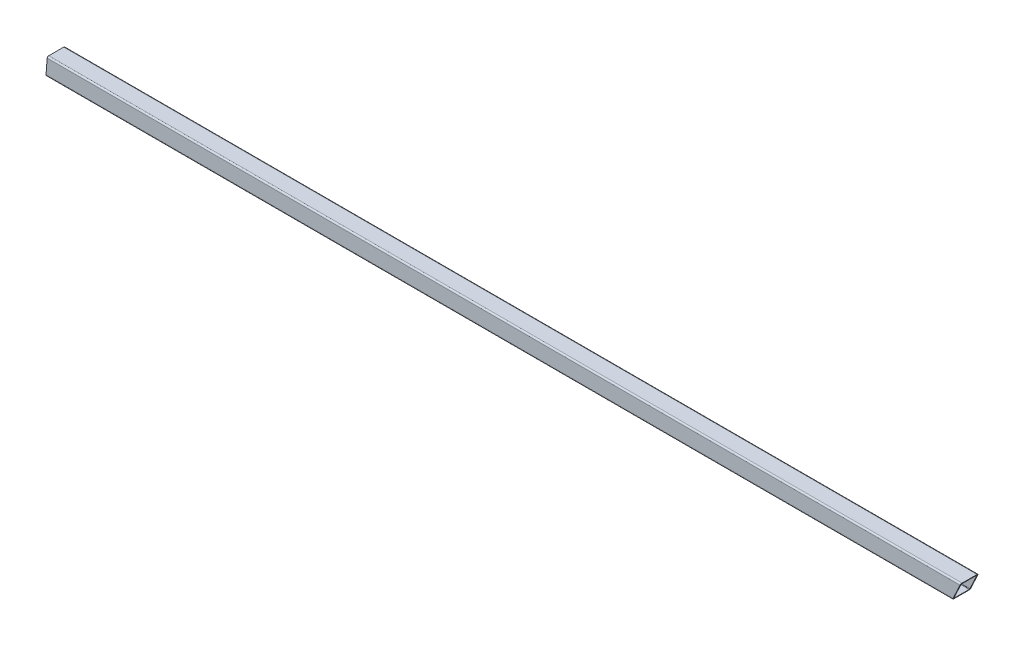
ISO-10303-21;
HEADER;
FILE_DESCRIPTION(('STEP AP214'),'2;1');
FILE_NAME('part.step','',(''),(''),'','','');
FILE_SCHEMA(('AUTOMOTIVE_DESIGN { 1 0 10303 214 1 1 1 1 }'));
ENDSEC;
DATA;
#1=APPLICATION_CONTEXT('core data for automotive mechanical design processes');
#2=APPLICATION_PROTOCOL_DEFINITION('international standard','automotive_design',2000,#1);
#3=PRODUCT_CONTEXT('',#1,'mechanical');
#4=PRODUCT('Part','Part','',(#3));
#5=PRODUCT_RELATED_PRODUCT_CATEGORY('part','',(#4));
#6=PRODUCT_DEFINITION_FORMATION('','',#4);
#7=PRODUCT_DEFINITION_CONTEXT('part definition',#1,'design');
#8=PRODUCT_DEFINITION('design','',#6,#7);
#9=PRODUCT_DEFINITION_SHAPE('','',#8);
#10=(LENGTH_UNIT() NAMED_UNIT(*) SI_UNIT(.MILLI.,.METRE.));
#11=(NAMED_UNIT(*) PLANE_ANGLE_UNIT() SI_UNIT($,.RADIAN.));
#12=(NAMED_UNIT(*) SI_UNIT($,.STERADIAN.) SOLID_ANGLE_UNIT());
#13=UNCERTAINTY_MEASURE_WITH_UNIT(LENGTH_MEASURE(1.E-05),#10,'distance_accuracy_value','');
#14=(GEOMETRIC_REPRESENTATION_CONTEXT(3) GLOBAL_UNCERTAINTY_ASSIGNED_CONTEXT((#13)) GLOBAL_UNIT_ASSIGNED_CONTEXT((#10,
#11,#12)) REPRESENTATION_CONTEXT('',''));
#15=CARTESIAN_POINT('',(0.,0.,0.));
#16=DIRECTION('',(0.,0.,1.));
#17=DIRECTION('',(1.,0.,0.));
#18=AXIS2_PLACEMENT_3D('',#15,#16,#17);
#19=CARTESIAN_POINT('',(1320.8,10.1854,21.209));
#20=DIRECTION('',(0.,1.,0.));
#21=DIRECTION('',(0.,0.,1.));
#22=AXIS2_PLACEMENT_3D('',#19,#20,#21);
#23=PLANE('',#22);
#24=DIRECTION('',(0.,0.,1.));
#25=VECTOR('',#24,1.);
#26=CARTESIAN_POINT('',(1315.18584231888,10.1854,21.209));
#27=LINE('',#26,#25);
#28=CARTESIAN_POINT('',(1315.18584231888,10.1854,10.541));
#29=VERTEX_POINT('',#28);
#30=CARTESIAN_POINT('',(1315.18584231888,10.1854,21.209));
#31=VERTEX_POINT('',#30);
#32=EDGE_CURVE('E11',#29,#31,#27,.T.);
#33=ORIENTED_EDGE('',*,*,#32,.F.);
#34=DIRECTION('',(-1.,0.,0.));
#35=VECTOR('',#34,1.);
#36=CARTESIAN_POINT('',(1320.8,10.1854,10.541));
#37=LINE('',#36,#35);
#38=CARTESIAN_POINT('',(669.151527464938,10.1854,10.541));
#39=VERTEX_POINT('',#38);
#40=EDGE_CURVE('E197',#29,#39,#37,.T.);
#41=ORIENTED_EDGE('',*,*,#40,.T.);
#42=DIRECTION('',(0.,0.,-1.));
#43=VECTOR('',#42,1.);
#44=CARTESIAN_POINT('',(669.151527464938,10.1854,21.209));
#45=LINE('',#44,#43);
#46=CARTESIAN_POINT('',(669.151527464938,10.1854,21.209));
#47=VERTEX_POINT('',#46);
#48=EDGE_CURVE('E53',#47,#39,#45,.T.);
#49=ORIENTED_EDGE('',*,*,#48,.F.);
#50=DIRECTION('',(-1.,0.,0.));
#51=VECTOR('',#50,1.);
#52=CARTESIAN_POINT('',(1320.8,10.1854,21.209));
#53=LINE('',#52,#51);
#54=EDGE_CURVE('E200',#31,#47,#53,.T.);
#55=ORIENTED_EDGE('',*,*,#54,.F.);
#56=EDGE_LOOP('',(#33,#41,#49,#55));
#57=FACE_BOUND('',#56,.T.);
#58=ADVANCED_FACE('F46',(#57),#23,.T.);
#59=CARTESIAN_POINT('',(1320.8,10.541,21.209));
#60=DIRECTION('',(-1.,0.,0.));
#61=DIRECTION('',(0.,0.,1.));
#62=AXIS2_PLACEMENT_3D('',#59,#60,#61);
#63=CYLINDRICAL_SURFACE('',#62,0.355600000000001);
#64=CARTESIAN_POINT('',(1315.35166132212,10.541,21.209));
#65=DIRECTION('',(-0.906307787036651,0.422618261740698,0.));
#66=DIRECTION('',(-0.422618261740698,-0.906307787036651,0.));
#67=AXIS2_PLACEMENT_3D('',#64,#65,#66);
#68=ELLIPSE('',#67,0.392361187983063,0.355600000000001);
#69=CARTESIAN_POINT('',(1315.35166132212,10.541,21.5646));
#70=VERTEX_POINT('',#69);
#71=EDGE_CURVE('E276',#31,#70,#68,.T.);
#72=ORIENTED_EDGE('',*,*,#71,.F.);
#73=ORIENTED_EDGE('',*,*,#54,.T.);
#74=CARTESIAN_POINT('',(669.179554768912,10.541,21.209));
#75=DIRECTION('',(0.996908341817186,-0.0785732652707514,0.));
#76=DIRECTION('',(-0.0785732652707514,-0.996908341817186,0.));
#77=AXIS2_PLACEMENT_3D('',#74,#75,#76);
#78=ELLIPSE('',#77,0.356702803140162,0.355600000000001);
#79=CARTESIAN_POINT('',(669.179554768912,10.541,21.5646));
#80=VERTEX_POINT('',#79);
#81=EDGE_CURVE('E259',#80,#47,#78,.T.);
#82=ORIENTED_EDGE('',*,*,#81,.F.);
#83=DIRECTION('',(-1.,0.,0.));
#84=VECTOR('',#83,1.);
#85=CARTESIAN_POINT('',(1320.8,10.541,21.5646));
#86=LINE('',#85,#84);
#87=EDGE_CURVE('E218',#70,#80,#86,.T.);
#88=ORIENTED_EDGE('',*,*,#87,.F.);
#89=EDGE_LOOP('',(#72,#73,#82,#88));
#90=FACE_BOUND('',#89,.T.);
#91=ADVANCED_FACE('F310',(#90),#63,.F.);
#92=CARTESIAN_POINT('',(1320.8,21.209,21.5646));
#93=DIRECTION('',(0.,0.,-1.));
#94=DIRECTION('',(-1.,0.,0.));
#95=AXIS2_PLACEMENT_3D('',#92,#93,#94);
#96=PLANE('',#95);
#97=DIRECTION('',(0.422618261740698,0.906307787036651,0.));
#98=VECTOR('',#97,1.);
#99=CARTESIAN_POINT('',(1320.4108494229,21.3904638942792,21.5646));
#100=LINE('',#99,#98);
#101=CARTESIAN_POINT('',(1320.32623141931,21.209,21.5646));
#102=VERTEX_POINT('',#101);
#103=EDGE_CURVE('E278',#70,#102,#100,.T.);
#104=ORIENTED_EDGE('',*,*,#103,.F.);
#105=ORIENTED_EDGE('',*,*,#87,.T.);
#106=DIRECTION('',(-0.0785732652707514,-0.996908341817186,0.));
#107=VECTOR('',#106,1.);
#108=CARTESIAN_POINT('',(674.038129821038,72.1847917161635,21.5646));
#109=LINE('',#108,#107);
#110=CARTESIAN_POINT('',(670.020373888131,21.209,21.5646));
#111=VERTEX_POINT('',#110);
#112=EDGE_CURVE('E261',#111,#80,#109,.T.);
#113=ORIENTED_EDGE('',*,*,#112,.F.);
#114=DIRECTION('',(-1.,0.,0.));
#115=VECTOR('',#114,1.);
#116=CARTESIAN_POINT('',(1320.8,21.209,21.5646));
#117=LINE('',#116,#115);
#118=EDGE_CURVE('E215',#102,#111,#117,.T.);
#119=ORIENTED_EDGE('',*,*,#118,.F.);
#120=EDGE_LOOP('',(#104,#105,#113,#119));
#121=FACE_BOUND('',#120,.T.);
#122=ADVANCED_FACE('F315',(#121),#96,.T.);
#123=CARTESIAN_POINT('',(1320.8,21.209,21.209));
#124=DIRECTION('',(-1.,0.,0.));
#125=DIRECTION('',(0.,0.,1.));
#126=AXIS2_PLACEMENT_3D('',#123,#124,#125);
#127=CYLINDRICAL_SURFACE('',#126,0.355600000000003);
#128=CARTESIAN_POINT('',(1320.32623141931,21.209,21.209));
#129=DIRECTION('',(-0.906307787036651,0.422618261740698,0.));
#130=DIRECTION('',(-0.422618261740698,-0.906307787036651,0.));
#131=AXIS2_PLACEMENT_3D('',#128,#129,#130);
#132=ELLIPSE('',#131,0.392361187983065,0.355600000000003);
#133=CARTESIAN_POINT('',(1320.49205042255,21.5646,21.209));
#134=VERTEX_POINT('',#133);
#135=EDGE_CURVE('E280',#102,#134,#132,.T.);
#136=ORIENTED_EDGE('',*,*,#135,.F.);
#137=ORIENTED_EDGE('',*,*,#118,.T.);
#138=CARTESIAN_POINT('',(670.020373888131,21.209,21.209));
#139=DIRECTION('',(0.996908341817186,-0.0785732652707514,0.));
#140=DIRECTION('',(-0.0785732652707514,-0.996908341817186,0.));
#141=AXIS2_PLACEMENT_3D('',#138,#139,#140);
#142=ELLIPSE('',#141,0.356702803140164,0.355600000000003);
#143=CARTESIAN_POINT('',(670.048401192105,21.5646,21.209));
#144=VERTEX_POINT('',#143);
#145=EDGE_CURVE('E263',#144,#111,#142,.T.);
#146=ORIENTED_EDGE('',*,*,#145,.F.);
#147=DIRECTION('',(-1.,0.,0.));
#148=VECTOR('',#147,1.);
#149=CARTESIAN_POINT('',(1320.8,21.5646,21.209));
#150=LINE('',#149,#148);
#151=EDGE_CURVE('E212',#134,#144,#150,.T.);
#152=ORIENTED_EDGE('',*,*,#151,.F.);
#153=EDGE_LOOP('',(#136,#137,#146,#152));
#154=FACE_BOUND('',#153,.T.);
#155=ADVANCED_FACE('F344',(#154),#127,.F.);
#156=CARTESIAN_POINT('',(1320.8,21.5646,10.541));
#157=DIRECTION('',(0.,-1.,0.));
#158=DIRECTION('',(0.,0.,-1.));
#159=AXIS2_PLACEMENT_3D('',#156,#157,#158);
#160=PLANE('',#159);
#161=DIRECTION('',(0.,0.,-1.));
#162=VECTOR('',#161,1.);
#163=CARTESIAN_POINT('',(1320.49205042255,21.5646,10.541));
#164=LINE('',#163,#162);
#165=CARTESIAN_POINT('',(1320.49205042255,21.5646,10.541));
#166=VERTEX_POINT('',#165);
#167=EDGE_CURVE('E282',#134,#166,#164,.T.);
#168=ORIENTED_EDGE('',*,*,#167,.F.);
#169=ORIENTED_EDGE('',*,*,#151,.T.);
#170=DIRECTION('',(0.,0.,1.));
#171=VECTOR('',#170,1.);
#172=CARTESIAN_POINT('',(670.048401192105,21.5646,10.541));
#173=LINE('',#172,#171);
#174=CARTESIAN_POINT('',(670.048401192105,21.5646,10.541));
#175=VERTEX_POINT('',#174);
#176=EDGE_CURVE('E265',#175,#144,#173,.T.);
#177=ORIENTED_EDGE('',*,*,#176,.F.);
#178=DIRECTION('',(-1.,0.,0.));
#179=VECTOR('',#178,1.);
#180=CARTESIAN_POINT('',(1320.8,21.5646,10.541));
#181=LINE('',#180,#179);
#182=EDGE_CURVE('E209',#166,#175,#181,.T.);
#183=ORIENTED_EDGE('',*,*,#182,.F.);
#184=EDGE_LOOP('',(#168,#169,#177,#183));
#185=FACE_BOUND('',#184,.T.);
#186=ADVANCED_FACE('F340',(#185),#160,.T.);
#187=CARTESIAN_POINT('',(1320.8,21.209,10.541));
#188=DIRECTION('',(-1.,0.,0.));
#189=DIRECTION('',(0.,0.,1.));
#190=AXIS2_PLACEMENT_3D('',#187,#188,#189);
#191=CYLINDRICAL_SURFACE('',#190,0.3556);
#192=CARTESIAN_POINT('',(1320.32623141931,21.209,10.541));
#193=DIRECTION('',(-0.906307787036651,0.422618261740698,0.));
#194=DIRECTION('',(-0.422618261740698,-0.906307787036651,0.));
#195=AXIS2_PLACEMENT_3D('',#192,#193,#194);
#196=ELLIPSE('',#195,0.392361187983062,0.3556);
#197=CARTESIAN_POINT('',(1320.32623141931,21.209,10.1854));
#198=VERTEX_POINT('',#197);
#199=EDGE_CURVE('E284',#166,#198,#196,.T.);
#200=ORIENTED_EDGE('',*,*,#199,.F.);
#201=ORIENTED_EDGE('',*,*,#182,.T.);
#202=CARTESIAN_POINT('',(670.020373888131,21.209,10.541));
#203=DIRECTION('',(0.996908341817186,-0.0785732652707514,0.));
#204=DIRECTION('',(-0.0785732652707514,-0.996908341817186,0.));
#205=AXIS2_PLACEMENT_3D('',#202,#203,#204);
#206=ELLIPSE('',#205,0.356702803140161,0.3556);
#207=CARTESIAN_POINT('',(670.020373888131,21.209,10.1854));
#208=VERTEX_POINT('',#207);
#209=EDGE_CURVE('E267',#208,#175,#206,.T.);
#210=ORIENTED_EDGE('',*,*,#209,.F.);
#211=DIRECTION('',(-1.,0.,0.));
#212=VECTOR('',#211,1.);
#213=CARTESIAN_POINT('',(1320.8,21.209,10.1854));
#214=LINE('',#213,#212);
#215=EDGE_CURVE('E206',#198,#208,#214,.T.);
#216=ORIENTED_EDGE('',*,*,#215,.F.);
#217=EDGE_LOOP('',(#200,#201,#210,#216));
#218=FACE_BOUND('',#217,.T.);
#219=ADVANCED_FACE('F334',(#218),#191,.F.);
#220=CARTESIAN_POINT('',(1320.8,10.541,10.1854));
#221=DIRECTION('',(0.,0.,1.));
#222=DIRECTION('',(1.,0.,0.));
#223=AXIS2_PLACEMENT_3D('',#220,#221,#222);
#224=PLANE('',#223);
#225=DIRECTION('',(-0.422618261740698,-0.906307787036651,0.));
#226=VECTOR('',#225,1.);
#227=CARTESIAN_POINT('',(1316.3247683633,12.6278347842112,10.1854));
#228=LINE('',#227,#226);
#229=CARTESIAN_POINT('',(1315.35166132212,10.541,10.1854));
#230=VERTEX_POINT('',#229);
#231=EDGE_CURVE('E286',#198,#230,#228,.T.);
#232=ORIENTED_EDGE('',*,*,#231,.F.);
#233=ORIENTED_EDGE('',*,*,#215,.T.);
#234=DIRECTION('',(0.0785732652707514,0.996908341817186,0.));
#235=VECTOR('',#234,1.);
#236=CARTESIAN_POINT('',(673.202501715596,61.5826533666708,10.1854));
#237=LINE('',#236,#235);
#238=CARTESIAN_POINT('',(669.179554768912,10.541,10.1854));
#239=VERTEX_POINT('',#238);
#240=EDGE_CURVE('E269',#239,#208,#237,.T.);
#241=ORIENTED_EDGE('',*,*,#240,.F.);
#242=DIRECTION('',(-1.,0.,0.));
#243=VECTOR('',#242,1.);
#244=CARTESIAN_POINT('',(1320.8,10.541,10.1854));
#245=LINE('',#244,#243);
#246=EDGE_CURVE('E202',#230,#239,#245,.T.);
#247=ORIENTED_EDGE('',*,*,#246,.F.);
#248=EDGE_LOOP('',(#232,#233,#241,#247));
#249=FACE_BOUND('',#248,.T.);
#250=ADVANCED_FACE('F330',(#249),#224,.T.);
#251=CARTESIAN_POINT('',(1320.8,10.541,10.541));
#252=DIRECTION('',(-1.,0.,0.));
#253=DIRECTION('',(0.,0.,1.));
#254=AXIS2_PLACEMENT_3D('',#251,#252,#253);
#255=CYLINDRICAL_SURFACE('',#254,0.3556);
#256=CARTESIAN_POINT('',(1315.35166132212,10.541,10.541));
#257=DIRECTION('',(-0.906307787036651,0.422618261740698,0.));
#258=DIRECTION('',(-0.422618261740698,-0.906307787036651,0.));
#259=AXIS2_PLACEMENT_3D('',#256,#257,#258);
#260=ELLIPSE('',#259,0.392361187983062,0.3556);
#261=EDGE_CURVE('E248',#230,#29,#260,.T.);
#262=ORIENTED_EDGE('',*,*,#261,.F.);
#263=ORIENTED_EDGE('',*,*,#246,.T.);
#264=CARTESIAN_POINT('',(669.179554768912,10.541,10.541));
#265=DIRECTION('',(0.996908341817186,-0.0785732652707514,0.));
#266=DIRECTION('',(-0.0785732652707514,-0.996908341817186,0.));
#267=AXIS2_PLACEMENT_3D('',#264,#265,#266);
#268=ELLIPSE('',#267,0.356702803140161,0.3556);
#269=EDGE_CURVE('E271',#39,#239,#268,.T.);
#270=ORIENTED_EDGE('',*,*,#269,.F.);
#271=ORIENTED_EDGE('',*,*,#40,.F.);
#272=EDGE_LOOP('',(#262,#263,#270,#271));
#273=FACE_BOUND('',#272,.T.);
#274=ADVANCED_FACE('F324',(#273),#255,.F.);
#275=CARTESIAN_POINT('',(670.100451899485,22.225,22.225));
#276=DIRECTION('',(0.996908341817186,-0.0785732652707514,0.));
#277=DIRECTION('',(0.0785732652707514,0.996908341817186,0.));
#278=AXIS2_PLACEMENT_3D('',#275,#276,#277);
#279=PLANE('',#278);
#280=ORIENTED_EDGE('',*,*,#269,.T.);
#281=ORIENTED_EDGE('',*,*,#240,.T.);
#282=ORIENTED_EDGE('',*,*,#209,.T.);
#283=ORIENTED_EDGE('',*,*,#176,.T.);
#284=ORIENTED_EDGE('',*,*,#145,.T.);
#285=ORIENTED_EDGE('',*,*,#112,.T.);
#286=ORIENTED_EDGE('',*,*,#81,.T.);
#287=ORIENTED_EDGE('',*,*,#48,.T.);
#288=EDGE_LOOP('',(#280,#281,#282,#283,#284,#285,#286,#287));
#289=FACE_BOUND('',#288,.T.);
#290=DIRECTION('',(-0.0785732652707514,-0.996908341817186,0.));
#291=VECTOR('',#290,1.);
#292=CARTESIAN_POINT('',(670.100451899485,22.225,22.225));
#293=LINE('',#292,#291);
#294=CARTESIAN_POINT('',(670.020373888131,21.209,22.225));
#295=VERTEX_POINT('',#294);
#296=CARTESIAN_POINT('',(669.179554768912,10.541,22.225));
#297=VERTEX_POINT('',#296);
#298=EDGE_CURVE('E178',#295,#297,#293,.T.);
#299=ORIENTED_EDGE('',*,*,#298,.F.);
#300=CARTESIAN_POINT('',(670.020373888131,21.209,21.209));
#301=DIRECTION('',(0.996908341817186,-0.0785732652707514,0.));
#302=DIRECTION('',(-0.0785732652707514,-0.996908341817186,0.));
#303=AXIS2_PLACEMENT_3D('',#300,#301,#302);
#304=ELLIPSE('',#303,1.01915086611475,1.016);
#305=CARTESIAN_POINT('',(670.100451899485,22.225,21.209));
#306=VERTEX_POINT('',#305);
#307=EDGE_CURVE('E167',#306,#295,#304,.T.);
#308=ORIENTED_EDGE('',*,*,#307,.F.);
#309=DIRECTION('',(0.,0.,-1.));
#310=VECTOR('',#309,1.);
#311=CARTESIAN_POINT('',(670.100451899485,22.225,22.225));
#312=LINE('',#311,#310);
#313=CARTESIAN_POINT('',(670.100451899485,22.225,10.541));
#314=VERTEX_POINT('',#313);
#315=EDGE_CURVE('E161',#306,#314,#312,.T.);
#316=ORIENTED_EDGE('',*,*,#315,.T.);
#317=CARTESIAN_POINT('',(670.020373888131,21.209,10.541));
#318=DIRECTION('',(0.996908341817186,-0.0785732652707514,0.));
#319=DIRECTION('',(-0.0785732652707514,-0.996908341817186,0.));
#320=AXIS2_PLACEMENT_3D('',#317,#318,#319);
#321=ELLIPSE('',#320,1.01915086611474,1.016);
#322=CARTESIAN_POINT('',(670.020373888131,21.209,9.52499999999999));
#323=VERTEX_POINT('',#322);
#324=EDGE_CURVE('E155',#323,#314,#321,.T.);
#325=ORIENTED_EDGE('',*,*,#324,.F.);
#326=DIRECTION('',(-0.0785732652707514,-0.996908341817186,0.));
#327=VECTOR('',#326,1.);
#328=CARTESIAN_POINT('',(670.100451899485,22.225,9.52499999999999));
#329=LINE('',#328,#327);
#330=CARTESIAN_POINT('',(669.179554768912,10.541,9.52499999999999));
#331=VERTEX_POINT('',#330);
#332=EDGE_CURVE('E158',#323,#331,#329,.T.);
#333=ORIENTED_EDGE('',*,*,#332,.T.);
#334=CARTESIAN_POINT('',(669.179554768912,10.541,10.541));
#335=DIRECTION('',(0.996908341817186,-0.0785732652707514,0.));
#336=DIRECTION('',(-0.0785732652707514,-0.996908341817186,0.));
#337=AXIS2_PLACEMENT_3D('',#334,#335,#336);
#338=ELLIPSE('',#337,1.01915086611474,1.016);
#339=CARTESIAN_POINT('',(669.099476757558,9.525,10.541));
#340=VERTEX_POINT('',#339);
#341=EDGE_CURVE('E166',#340,#331,#338,.T.);
#342=ORIENTED_EDGE('',*,*,#341,.F.);
#343=DIRECTION('',(0.,0.,-1.));
#344=VECTOR('',#343,1.);
#345=CARTESIAN_POINT('',(669.099476757558,9.525,22.225));
#346=LINE('',#345,#344);
#347=CARTESIAN_POINT('',(669.099476757558,9.525,21.209));
#348=VERTEX_POINT('',#347);
#349=EDGE_CURVE('E251',#348,#340,#346,.T.);
#350=ORIENTED_EDGE('',*,*,#349,.F.);
#351=CARTESIAN_POINT('',(669.179554768912,10.541,21.209));
#352=DIRECTION('',(0.996908341817186,-0.0785732652707514,0.));
#353=DIRECTION('',(-0.0785732652707514,-0.996908341817186,0.));
#354=AXIS2_PLACEMENT_3D('',#351,#352,#353);
#355=ELLIPSE('',#354,1.01915086611474,1.016);
#356=EDGE_CURVE('E68',#297,#348,#355,.T.);
#357=ORIENTED_EDGE('',*,*,#356,.F.);
#358=EDGE_LOOP('',(#299,#308,#316,#325,#333,#342,#350,#357));
#359=FACE_BOUND('',#358,.T.);
#360=ADVANCED_FACE('F157',(#289,#359),#279,.F.);
#361=CARTESIAN_POINT('',(1320.8,22.225,22.225));
#362=DIRECTION('',(-0.906307787036651,0.422618261740698,0.));
#363=DIRECTION('',(-0.422618261740698,-0.906307787036651,0.));
#364=AXIS2_PLACEMENT_3D('',#361,#362,#363);
#365=PLANE('',#364);
#366=ORIENTED_EDGE('',*,*,#261,.T.);
#367=ORIENTED_EDGE('',*,*,#32,.T.);
#368=ORIENTED_EDGE('',*,*,#71,.T.);
#369=ORIENTED_EDGE('',*,*,#103,.T.);
#370=ORIENTED_EDGE('',*,*,#135,.T.);
#371=ORIENTED_EDGE('',*,*,#167,.T.);
#372=ORIENTED_EDGE('',*,*,#199,.T.);
#373=ORIENTED_EDGE('',*,*,#231,.T.);
#374=EDGE_LOOP('',(#366,#367,#368,#369,#370,#371,#372,#373));
#375=FACE_BOUND('',#374,.T.);
#376=DIRECTION('',(0.,0.,-1.));
#377=VECTOR('',#376,1.);
#378=CARTESIAN_POINT('',(1314.87789274143,9.525,22.225));
#379=LINE('',#378,#377);
#380=CARTESIAN_POINT('',(1314.87789274143,9.525,21.209));
#381=VERTEX_POINT('',#380);
#382=CARTESIAN_POINT('',(1314.87789274143,9.525,10.541));
#383=VERTEX_POINT('',#382);
#384=EDGE_CURVE('E256',#381,#383,#379,.T.);
#385=ORIENTED_EDGE('',*,*,#384,.T.);
#386=CARTESIAN_POINT('',(1315.35166132212,10.541,10.541));
#387=DIRECTION('',(-0.906307787036651,0.422618261740698,0.));
#388=DIRECTION('',(-0.422618261740698,-0.906307787036651,0.));
#389=AXIS2_PLACEMENT_3D('',#386,#387,#388);
#390=ELLIPSE('',#389,1.12103196566589,1.016);
#391=CARTESIAN_POINT('',(1315.35166132212,10.5409999999999,9.52499999999999));
#392=VERTEX_POINT('',#391);
#393=EDGE_CURVE('E290',#392,#383,#390,.T.);
#394=ORIENTED_EDGE('',*,*,#393,.F.);
#395=DIRECTION('',(0.422618261740698,0.906307787036651,0.));
#396=VECTOR('',#395,1.);
#397=CARTESIAN_POINT('',(1320.8,22.225,9.52499999999999));
#398=LINE('',#397,#396);
#399=CARTESIAN_POINT('',(1320.32623141931,21.209,9.52499999999999));
#400=VERTEX_POINT('',#399);
#401=EDGE_CURVE('E177',#392,#400,#398,.T.);
#402=ORIENTED_EDGE('',*,*,#401,.T.);
#403=CARTESIAN_POINT('',(1320.32623141931,21.209,10.541));
#404=DIRECTION('',(-0.906307787036651,0.422618261740698,0.));
#405=DIRECTION('',(-0.422618261740698,-0.906307787036651,0.));
#406=AXIS2_PLACEMENT_3D('',#403,#404,#405);
#407=ELLIPSE('',#406,1.12103196566589,1.016);
#408=CARTESIAN_POINT('',(1320.8,22.225,10.541));
#409=VERTEX_POINT('',#408);
#410=EDGE_CURVE('E182',#409,#400,#407,.T.);
#411=ORIENTED_EDGE('',*,*,#410,.F.);
#412=DIRECTION('',(0.,0.,1.));
#413=VECTOR('',#412,1.);
#414=CARTESIAN_POINT('',(1320.8,22.225,10.541));
#415=LINE('',#414,#413);
#416=CARTESIAN_POINT('',(1320.8,22.225,21.209));
#417=VERTEX_POINT('',#416);
#418=EDGE_CURVE('E205',#409,#417,#415,.T.);
#419=ORIENTED_EDGE('',*,*,#418,.T.);
#420=CARTESIAN_POINT('',(1320.32623141931,21.209,21.209));
#421=DIRECTION('',(-0.906307787036651,0.422618261740698,0.));
#422=DIRECTION('',(-0.422618261740698,-0.906307787036651,0.));
#423=AXIS2_PLACEMENT_3D('',#420,#421,#422);
#424=ELLIPSE('',#423,1.12103196566589,1.016);
#425=CARTESIAN_POINT('',(1320.32623141931,21.209,22.225));
#426=VERTEX_POINT('',#425);
#427=EDGE_CURVE('E60',#426,#417,#424,.T.);
#428=ORIENTED_EDGE('',*,*,#427,.F.);
#429=DIRECTION('',(0.422618261740698,0.906307787036651,0.));
#430=VECTOR('',#429,1.);
#431=CARTESIAN_POINT('',(1320.8,22.225,22.225));
#432=LINE('',#431,#430);
#433=CARTESIAN_POINT('',(1315.35166132212,10.541,22.225));
#434=VERTEX_POINT('',#433);
#435=EDGE_CURVE('E295',#434,#426,#432,.T.);
#436=ORIENTED_EDGE('',*,*,#435,.F.);
#437=CARTESIAN_POINT('',(1315.35166132212,10.541,21.209));
#438=DIRECTION('',(-0.906307787036651,0.422618261740698,0.));
#439=DIRECTION('',(-0.422618261740698,-0.906307787036651,0.));
#440=AXIS2_PLACEMENT_3D('',#437,#438,#439);
#441=ELLIPSE('',#440,1.12103196566589,1.016);
#442=EDGE_CURVE('E201',#381,#434,#441,.T.);
#443=ORIENTED_EDGE('',*,*,#442,.F.);
#444=EDGE_LOOP('',(#385,#394,#402,#411,#419,#428,#436,#443));
#445=FACE_BOUND('',#444,.T.);
#446=ADVANCED_FACE('F241',(#375,#445),#365,.F.);
#447=CARTESIAN_POINT('',(1320.8,21.209,22.225));
#448=DIRECTION('',(0.,0.,-1.));
#449=DIRECTION('',(0.,1.,0.));
#450=AXIS2_PLACEMENT_3D('',#447,#448,#449);
#451=PLANE('',#450);
#452=DIRECTION('',(-1.,0.,0.));
#453=VECTOR('',#452,1.);
#454=CARTESIAN_POINT('',(1320.8,10.541,22.225));
#455=LINE('',#454,#453);
#456=EDGE_CURVE('E196',#434,#297,#455,.T.);
#457=ORIENTED_EDGE('',*,*,#456,.F.);
#458=ORIENTED_EDGE('',*,*,#435,.T.);
#459=DIRECTION('',(-1.,0.,0.));
#460=VECTOR('',#459,1.);
#461=CARTESIAN_POINT('',(1320.8,21.209,22.225));
#462=LINE('',#461,#460);
#463=EDGE_CURVE('E193',#426,#295,#462,.T.);
#464=ORIENTED_EDGE('',*,*,#463,.T.);
#465=ORIENTED_EDGE('',*,*,#298,.T.);
#466=EDGE_LOOP('',(#457,#458,#464,#465));
#467=FACE_BOUND('',#466,.T.);
#468=ADVANCED_FACE('F294',(#467),#451,.F.);
#469=CARTESIAN_POINT('',(1320.8,21.209,21.209));
#470=DIRECTION('',(-1.,0.,0.));
#471=DIRECTION('',(0.,0.,1.));
#472=AXIS2_PLACEMENT_3D('',#469,#470,#471);
#473=CYLINDRICAL_SURFACE('',#472,1.016);
#474=ORIENTED_EDGE('',*,*,#463,.F.);
#475=ORIENTED_EDGE('',*,*,#427,.T.);
#476=DIRECTION('',(-1.,0.,0.));
#477=VECTOR('',#476,1.);
#478=CARTESIAN_POINT('',(1320.8,22.225,21.209));
#479=LINE('',#478,#477);
#480=EDGE_CURVE('E187',#417,#306,#479,.T.);
#481=ORIENTED_EDGE('',*,*,#480,.T.);
#482=ORIENTED_EDGE('',*,*,#307,.T.);
#483=EDGE_LOOP('',(#474,#475,#481,#482));
#484=FACE_BOUND('',#483,.T.);
#485=ADVANCED_FACE('F246',(#484),#473,.T.);
#486=CARTESIAN_POINT('',(1320.8,22.225,10.541));
#487=DIRECTION('',(0.,-1.,0.));
#488=DIRECTION('',(0.,0.,-1.));
#489=AXIS2_PLACEMENT_3D('',#486,#487,#488);
#490=PLANE('',#489);
#491=DIRECTION('',(-1.,0.,0.));
#492=VECTOR('',#491,1.);
#493=CARTESIAN_POINT('',(1320.8,22.225,10.541));
#494=LINE('',#493,#492);
#495=EDGE_CURVE('E183',#409,#314,#494,.T.);
#496=ORIENTED_EDGE('',*,*,#495,.T.);
#497=ORIENTED_EDGE('',*,*,#315,.F.);
#498=ORIENTED_EDGE('',*,*,#480,.F.);
#499=ORIENTED_EDGE('',*,*,#418,.F.);
#500=EDGE_LOOP('',(#496,#497,#498,#499));
#501=FACE_BOUND('',#500,.T.);
#502=ADVANCED_FACE('F250',(#501),#490,.F.);
#503=CARTESIAN_POINT('',(1320.8,21.209,10.541));
#504=DIRECTION('',(-1.,0.,0.));
#505=DIRECTION('',(0.,0.,1.));
#506=AXIS2_PLACEMENT_3D('',#503,#504,#505);
#507=CYLINDRICAL_SURFACE('',#506,1.016);
#508=ORIENTED_EDGE('',*,*,#495,.F.);
#509=ORIENTED_EDGE('',*,*,#410,.T.);
#510=DIRECTION('',(-1.,0.,0.));
#511=VECTOR('',#510,1.);
#512=CARTESIAN_POINT('',(1320.8,21.209,9.52499999999999));
#513=LINE('',#512,#511);
#514=EDGE_CURVE('E174',#400,#323,#513,.T.);
#515=ORIENTED_EDGE('',*,*,#514,.T.);
#516=ORIENTED_EDGE('',*,*,#324,.T.);
#517=EDGE_LOOP('',(#508,#509,#515,#516));
#518=FACE_BOUND('',#517,.T.);
#519=ADVANCED_FACE('F181',(#518),#507,.T.);
#520=CARTESIAN_POINT('',(1320.8,10.541,9.52499999999999));
#521=DIRECTION('',(0.,0.,1.));
#522=DIRECTION('',(1.,0.,0.));
#523=AXIS2_PLACEMENT_3D('',#520,#521,#522);
#524=PLANE('',#523);
#525=ORIENTED_EDGE('',*,*,#514,.F.);
#526=ORIENTED_EDGE('',*,*,#401,.F.);
#527=DIRECTION('',(-1.,0.,0.));
#528=VECTOR('',#527,1.);
#529=CARTESIAN_POINT('',(1320.8,10.541,9.52499999999999));
#530=LINE('',#529,#528);
#531=EDGE_CURVE('E176',#392,#331,#530,.T.);
#532=ORIENTED_EDGE('',*,*,#531,.T.);
#533=ORIENTED_EDGE('',*,*,#332,.F.);
#534=EDGE_LOOP('',(#525,#526,#532,#533));
#535=FACE_BOUND('',#534,.T.);
#536=ADVANCED_FACE('F172',(#535),#524,.F.);
#537=CARTESIAN_POINT('',(1320.8,10.541,10.541));
#538=DIRECTION('',(-1.,0.,0.));
#539=DIRECTION('',(0.,0.,1.));
#540=AXIS2_PLACEMENT_3D('',#537,#538,#539);
#541=CYLINDRICAL_SURFACE('',#540,1.016);
#542=ORIENTED_EDGE('',*,*,#531,.F.);
#543=ORIENTED_EDGE('',*,*,#393,.T.);
#544=DIRECTION('',(-1.,0.,0.));
#545=VECTOR('',#544,1.);
#546=CARTESIAN_POINT('',(1320.8,9.525,10.541));
#547=LINE('',#546,#545);
#548=EDGE_CURVE('E185',#383,#340,#547,.T.);
#549=ORIENTED_EDGE('',*,*,#548,.T.);
#550=ORIENTED_EDGE('',*,*,#341,.T.);
#551=EDGE_LOOP('',(#542,#543,#549,#550));
#552=FACE_BOUND('',#551,.T.);
#553=ADVANCED_FACE('F298',(#552),#541,.T.);
#554=CARTESIAN_POINT('',(1320.8,9.525,21.209));
#555=DIRECTION('',(0.,1.,0.));
#556=DIRECTION('',(0.,0.,1.));
#557=AXIS2_PLACEMENT_3D('',#554,#555,#556);
#558=PLANE('',#557);
#559=ORIENTED_EDGE('',*,*,#548,.F.);
#560=ORIENTED_EDGE('',*,*,#384,.F.);
#561=DIRECTION('',(-1.,0.,0.));
#562=VECTOR('',#561,1.);
#563=CARTESIAN_POINT('',(1320.8,9.525,21.209));
#564=LINE('',#563,#562);
#565=EDGE_CURVE('E222',#381,#348,#564,.T.);
#566=ORIENTED_EDGE('',*,*,#565,.T.);
#567=ORIENTED_EDGE('',*,*,#349,.T.);
#568=EDGE_LOOP('',(#559,#560,#566,#567));
#569=FACE_BOUND('',#568,.T.);
#570=ADVANCED_FACE('F300',(#569),#558,.F.);
#571=CARTESIAN_POINT('',(1320.8,10.541,21.209));
#572=DIRECTION('',(-1.,0.,0.));
#573=DIRECTION('',(0.,0.,1.));
#574=AXIS2_PLACEMENT_3D('',#571,#572,#573);
#575=CYLINDRICAL_SURFACE('',#574,1.016);
#576=ORIENTED_EDGE('',*,*,#565,.F.);
#577=ORIENTED_EDGE('',*,*,#442,.T.);
#578=ORIENTED_EDGE('',*,*,#456,.T.);
#579=ORIENTED_EDGE('',*,*,#356,.T.);
#580=EDGE_LOOP('',(#576,#577,#578,#579));
#581=FACE_BOUND('',#580,.T.);
#582=ADVANCED_FACE('F292',(#581),#575,.T.);
#583=CLOSED_SHELL('',(#58,#91,#122,#155,#186,#219,#250,#274,#360,#446,#468,#485,#502,#519,#536,
#553,#570,#582));
#584=MANIFOLD_SOLID_BREP('B2',#583);
#585=ADVANCED_BREP_SHAPE_REPRESENTATION('',(#18,#584),#14);
#586=SHAPE_DEFINITION_REPRESENTATION(#9,#585);
ENDSEC;
END-ISO-10303-21;
